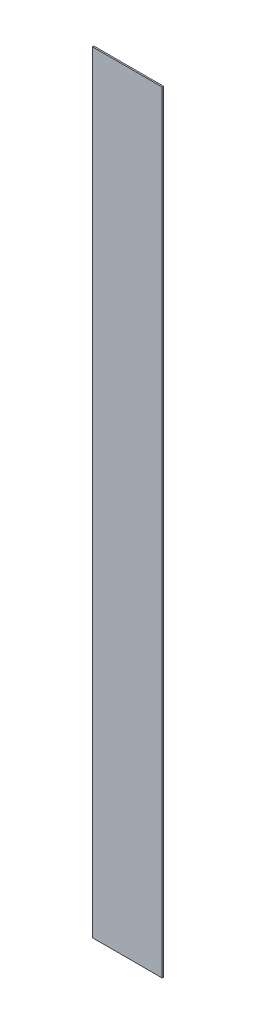
ISO-10303-21;
HEADER;
FILE_DESCRIPTION(('STEP AP214'),'2;1');
FILE_NAME('part.step','',(''),(''),'','','');
FILE_SCHEMA(('AUTOMOTIVE_DESIGN { 1 0 10303 214 1 1 1 1 }'));
ENDSEC;
DATA;
#1=APPLICATION_CONTEXT('core data for automotive mechanical design processes');
#2=APPLICATION_PROTOCOL_DEFINITION('international standard','automotive_design',2000,#1);
#3=PRODUCT_CONTEXT('',#1,'mechanical');
#4=PRODUCT('Part','Part','',(#3));
#5=PRODUCT_RELATED_PRODUCT_CATEGORY('part','',(#4));
#6=PRODUCT_DEFINITION_FORMATION('','',#4);
#7=PRODUCT_DEFINITION_CONTEXT('part definition',#1,'design');
#8=PRODUCT_DEFINITION('design','',#6,#7);
#9=PRODUCT_DEFINITION_SHAPE('','',#8);
#10=(LENGTH_UNIT() NAMED_UNIT(*) SI_UNIT(.MILLI.,.METRE.));
#11=(NAMED_UNIT(*) PLANE_ANGLE_UNIT() SI_UNIT($,.RADIAN.));
#12=(NAMED_UNIT(*) SI_UNIT($,.STERADIAN.) SOLID_ANGLE_UNIT());
#13=UNCERTAINTY_MEASURE_WITH_UNIT(LENGTH_MEASURE(1.E-05),#10,'distance_accuracy_value','');
#14=(GEOMETRIC_REPRESENTATION_CONTEXT(3) GLOBAL_UNCERTAINTY_ASSIGNED_CONTEXT((#13)) GLOBAL_UNIT_ASSIGNED_CONTEXT((#10,
#11,#12)) REPRESENTATION_CONTEXT('',''));
#15=CARTESIAN_POINT('',(0.,0.,0.));
#16=DIRECTION('',(0.,0.,1.));
#17=DIRECTION('',(1.,0.,0.));
#18=AXIS2_PLACEMENT_3D('',#15,#16,#17);
#19=CARTESIAN_POINT('',(91.994202332743,20.730799991109,2.51));
#20=DIRECTION('',(0.,0.,1.));
#21=DIRECTION('',(1.,0.,0.));
#22=AXIS2_PLACEMENT_3D('',#19,#20,#21);
#23=PLANE('',#22);
#24=DIRECTION('',(8.74227765734797E-08,-0.999999999999996,0.));
#25=VECTOR('',#24,1.);
#26=CARTESIAN_POINT('',(91.494202332743,20.730799947398,2.51));
#27=LINE('',#26,#25);
#28=CARTESIAN_POINT('',(91.494202090652,20.7307999473979,2.51));
#29=VERTEX_POINT('',#28);
#30=CARTESIAN_POINT('',(91.4942018485609,26.2692017105575,2.51));
#31=VERTEX_POINT('',#30);
#32=EDGE_CURVE('E53',#29,#31,#27,.F.);
#33=ORIENTED_EDGE('',*,*,#32,.F.);
#34=DIRECTION('',(1.,0.,0.));
#35=VECTOR('',#34,1.);
#36=CARTESIAN_POINT('',(91.994202332743,20.730799947398,2.51));
#37=LINE('',#36,#35);
#38=CARTESIAN_POINT('',(91.9942023327431,20.7307999692535,2.51));
#39=VERTEX_POINT('',#38);
#40=EDGE_CURVE('E20',#29,#39,#37,.T.);
#41=ORIENTED_EDGE('',*,*,#40,.T.);
#42=DIRECTION('',(-8.74227765734797E-08,0.999999999999996,0.));
#43=VECTOR('',#42,1.);
#44=CARTESIAN_POINT('',(91.994201848561,26.269201732413,2.51));
#45=LINE('',#44,#43);
#46=CARTESIAN_POINT('',(91.994202090652,26.2692017324131,2.51));
#47=VERTEX_POINT('',#46);
#48=EDGE_CURVE('E67',#47,#39,#45,.F.);
#49=ORIENTED_EDGE('',*,*,#48,.F.);
#50=DIRECTION('',(-0.999999999999996,-8.74227765734797E-08,0.));
#51=VECTOR('',#50,1.);
#52=CARTESIAN_POINT('',(91.494201848561,26.269201688702,2.51));
#53=LINE('',#52,#51);
#54=EDGE_CURVE('E58',#31,#47,#53,.F.);
#55=ORIENTED_EDGE('',*,*,#54,.F.);
#56=EDGE_LOOP('',(#33,#41,#49,#55));
#57=FACE_BOUND('',#56,.T.);
#58=ADVANCED_FACE('F17',(#57),#23,.T.);
#59=CARTESIAN_POINT('',(91.994201848561,26.269201732413,2.5));
#60=DIRECTION('',(0.999999999999996,8.74227765734797E-08,0.));
#61=DIRECTION('',(-8.74227765734797E-08,0.999999999999996,0.));
#62=AXIS2_PLACEMENT_3D('',#59,#60,#61);
#63=PLANE('',#62);
#64=DIRECTION('',(0.,0.,1.));
#65=VECTOR('',#64,1.);
#66=CARTESIAN_POINT('',(91.994202332743,20.730799991109,2.5));
#67=LINE('',#66,#65);
#68=CARTESIAN_POINT('',(91.9942023327432,20.7307999801812,2.5));
#69=VERTEX_POINT('',#68);
#70=EDGE_CURVE('E80',#69,#39,#67,.T.);
#71=ORIENTED_EDGE('',*,*,#70,.F.);
#72=DIRECTION('',(0.,1.,0.));
#73=VECTOR('',#72,1.);
#74=CARTESIAN_POINT('',(91.994202332743,20.730799991109,2.5));
#75=LINE('',#74,#73);
#76=CARTESIAN_POINT('',(91.9942019696065,26.2692017324131,2.5));
#77=VERTEX_POINT('',#76);
#78=EDGE_CURVE('E75',#69,#77,#75,.T.);
#79=ORIENTED_EDGE('',*,*,#78,.T.);
#80=DIRECTION('',(0.,0.,1.));
#81=VECTOR('',#80,1.);
#82=CARTESIAN_POINT('',(91.994201848561,26.2692017324134,2.5));
#83=LINE('',#82,#81);
#84=EDGE_CURVE('E63',#47,#77,#83,.F.);
#85=ORIENTED_EDGE('',*,*,#84,.F.);
#86=ORIENTED_EDGE('',*,*,#48,.T.);
#87=EDGE_LOOP('',(#71,#79,#85,#86));
#88=FACE_BOUND('',#87,.T.);
#89=ADVANCED_FACE('F74',(#88),#63,.T.);
#90=CARTESIAN_POINT('',(91.494201848561,26.269201688702,2.5));
#91=DIRECTION('',(-8.74227765734797E-08,0.999999999999996,0.));
#92=DIRECTION('',(-0.999999999999996,-8.74227765734797E-08,0.));
#93=AXIS2_PLACEMENT_3D('',#90,#91,#92);
#94=PLANE('',#93);
#95=ORIENTED_EDGE('',*,*,#84,.T.);
#96=DIRECTION('',(1.,0.,0.));
#97=VECTOR('',#96,1.);
#98=CARTESIAN_POINT('',(91.994202332743,26.269201732413,2.5));
#99=LINE('',#98,#97);
#100=CARTESIAN_POINT('',(91.4942018485609,26.2692016996298,2.5));
#101=VERTEX_POINT('',#100);
#102=EDGE_CURVE('E84',#77,#101,#99,.F.);
#103=ORIENTED_EDGE('',*,*,#102,.T.);
#104=DIRECTION('',(0.,0.,1.));
#105=VECTOR('',#104,1.);
#106=CARTESIAN_POINT('',(91.4942018485605,26.269201688702,2.5));
#107=LINE('',#106,#105);
#108=EDGE_CURVE('E65',#31,#101,#107,.F.);
#109=ORIENTED_EDGE('',*,*,#108,.F.);
#110=ORIENTED_EDGE('',*,*,#54,.T.);
#111=EDGE_LOOP('',(#95,#103,#109,#110));
#112=FACE_BOUND('',#111,.T.);
#113=ADVANCED_FACE('F60',(#112),#94,.T.);
#114=CARTESIAN_POINT('',(91.494202332743,20.730799947398,2.5));
#115=DIRECTION('',(-0.999999999999996,-8.74227765734797E-08,0.));
#116=DIRECTION('',(8.74227765734797E-08,-0.999999999999996,0.));
#117=AXIS2_PLACEMENT_3D('',#114,#115,#116);
#118=PLANE('',#117);
#119=ORIENTED_EDGE('',*,*,#108,.T.);
#120=DIRECTION('',(0.,1.,0.));
#121=VECTOR('',#120,1.);
#122=CARTESIAN_POINT('',(91.494201848561,20.730799991109,2.5));
#123=LINE('',#122,#121);
#124=CARTESIAN_POINT('',(91.4942022116975,20.7307999473979,2.5));
#125=VERTEX_POINT('',#124);
#126=EDGE_CURVE('E26',#101,#125,#123,.F.);
#127=ORIENTED_EDGE('',*,*,#126,.T.);
#128=DIRECTION('',(0.,0.,1.));
#129=VECTOR('',#128,1.);
#130=CARTESIAN_POINT('',(91.494202332743,20.7307999473976,2.5));
#131=LINE('',#130,#129);
#132=EDGE_CURVE('E34',#29,#125,#131,.F.);
#133=ORIENTED_EDGE('',*,*,#132,.F.);
#134=ORIENTED_EDGE('',*,*,#32,.T.);
#135=EDGE_LOOP('',(#119,#127,#133,#134));
#136=FACE_BOUND('',#135,.T.);
#137=ADVANCED_FACE('F88',(#136),#118,.T.);
#138=CARTESIAN_POINT('',(91.994202332743,20.730799991109,2.5));
#139=DIRECTION('',(8.74227765734797E-08,-0.999999999999996,0.));
#140=DIRECTION('',(0.999999999999996,8.74227765734797E-08,0.));
#141=AXIS2_PLACEMENT_3D('',#138,#139,#140);
#142=PLANE('',#141);
#143=ORIENTED_EDGE('',*,*,#132,.T.);
#144=DIRECTION('',(1.,0.,0.));
#145=VECTOR('',#144,1.);
#146=CARTESIAN_POINT('',(91.994202332743,20.730799947398,2.5));
#147=LINE('',#146,#145);
#148=EDGE_CURVE('E11',#125,#69,#147,.T.);
#149=ORIENTED_EDGE('',*,*,#148,.T.);
#150=ORIENTED_EDGE('',*,*,#70,.T.);
#151=ORIENTED_EDGE('',*,*,#40,.F.);
#152=EDGE_LOOP('',(#143,#149,#150,#151));
#153=FACE_BOUND('',#152,.T.);
#154=ADVANCED_FACE('F91',(#153),#142,.T.);
#155=CARTESIAN_POINT('',(91.994202332743,20.730799991109,2.5));
#156=DIRECTION('',(0.,0.,1.));
#157=DIRECTION('',(1.,0.,0.));
#158=AXIS2_PLACEMENT_3D('',#155,#156,#157);
#159=PLANE('',#158);
#160=ORIENTED_EDGE('',*,*,#126,.F.);
#161=ORIENTED_EDGE('',*,*,#102,.F.);
#162=ORIENTED_EDGE('',*,*,#78,.F.);
#163=ORIENTED_EDGE('',*,*,#148,.F.);
#164=EDGE_LOOP('',(#160,#161,#162,#163));
#165=FACE_BOUND('',#164,.T.);
#166=ADVANCED_FACE('F90',(#165),#159,.F.);
#167=CLOSED_SHELL('',(#58,#89,#113,#137,#154,#166));
#168=MANIFOLD_SOLID_BREP('B1',#167);
#169=ADVANCED_BREP_SHAPE_REPRESENTATION('',(#18,#168),#14);
#170=SHAPE_DEFINITION_REPRESENTATION(#9,#169);
ENDSEC;
END-ISO-10303-21;
